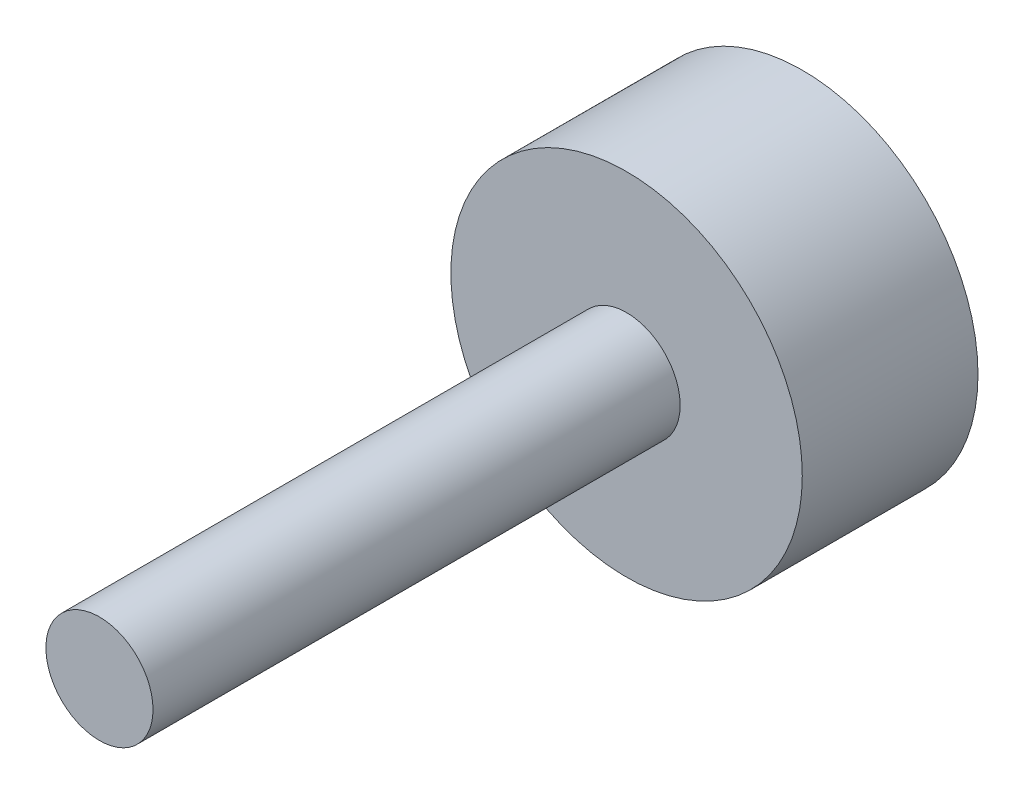
ISO-10303-21;
HEADER;
FILE_DESCRIPTION(('STEP AP214'),'2;1');
FILE_NAME('part.step','',(''),(''),'','','');
FILE_SCHEMA(('AUTOMOTIVE_DESIGN { 1 0 10303 214 1 1 1 1 }'));
ENDSEC;
DATA;
#1=APPLICATION_CONTEXT('core data for automotive mechanical design processes');
#2=APPLICATION_PROTOCOL_DEFINITION('international standard','automotive_design',2000,#1);
#3=PRODUCT_CONTEXT('',#1,'mechanical');
#4=PRODUCT('Part','Part','',(#3));
#5=PRODUCT_RELATED_PRODUCT_CATEGORY('part','',(#4));
#6=PRODUCT_DEFINITION_FORMATION('','',#4);
#7=PRODUCT_DEFINITION_CONTEXT('part definition',#1,'design');
#8=PRODUCT_DEFINITION('design','',#6,#7);
#9=PRODUCT_DEFINITION_SHAPE('','',#8);
#10=(LENGTH_UNIT() NAMED_UNIT(*) SI_UNIT(.MILLI.,.METRE.));
#11=(NAMED_UNIT(*) PLANE_ANGLE_UNIT() SI_UNIT($,.RADIAN.));
#12=(NAMED_UNIT(*) SI_UNIT($,.STERADIAN.) SOLID_ANGLE_UNIT());
#13=UNCERTAINTY_MEASURE_WITH_UNIT(LENGTH_MEASURE(1.E-05),#10,'distance_accuracy_value','');
#14=(GEOMETRIC_REPRESENTATION_CONTEXT(3) GLOBAL_UNCERTAINTY_ASSIGNED_CONTEXT((#13)) GLOBAL_UNIT_ASSIGNED_CONTEXT((#10,
#11,#12)) REPRESENTATION_CONTEXT('',''));
#15=CARTESIAN_POINT('',(0.,0.,0.));
#16=DIRECTION('',(0.,0.,1.));
#17=DIRECTION('',(1.,0.,0.));
#18=AXIS2_PLACEMENT_3D('',#15,#16,#17);
#19=CARTESIAN_POINT('',(0.,0.,5.));
#20=DIRECTION('',(0.,0.,-1.));
#21=DIRECTION('',(-1.,0.,0.));
#22=AXIS2_PLACEMENT_3D('',#19,#20,#21);
#23=CYLINDRICAL_SURFACE('',#22,5.);
#24=CARTESIAN_POINT('',(0.,0.,5.));
#25=DIRECTION('',(0.,0.,1.));
#26=DIRECTION('',(1.,0.,0.));
#27=AXIS2_PLACEMENT_3D('',#24,#25,#26);
#28=CIRCLE('',#27,5.);
#29=CARTESIAN_POINT('',(5.,0.,5.));
#30=VERTEX_POINT('',#29);
#31=EDGE_CURVE('E10',#30,#30,#28,.T.);
#32=ORIENTED_EDGE('',*,*,#31,.F.);
#33=EDGE_LOOP('',(#32));
#34=FACE_BOUND('',#33,.T.);
#35=CARTESIAN_POINT('',(0.,0.,0.));
#36=DIRECTION('',(0.,0.,1.));
#37=DIRECTION('',(1.,0.,0.));
#38=AXIS2_PLACEMENT_3D('',#35,#36,#37);
#39=CIRCLE('',#38,5.);
#40=CARTESIAN_POINT('',(5.,0.,0.));
#41=VERTEX_POINT('',#40);
#42=EDGE_CURVE('E35',#41,#41,#39,.T.);
#43=ORIENTED_EDGE('',*,*,#42,.T.);
#44=EDGE_LOOP('',(#43));
#45=FACE_BOUND('',#44,.T.);
#46=ADVANCED_FACE('F32',(#34,#45),#23,.T.);
#47=CARTESIAN_POINT('',(0.,0.,5.));
#48=DIRECTION('',(0.,0.,1.));
#49=DIRECTION('',(1.,0.,0.));
#50=AXIS2_PLACEMENT_3D('',#47,#48,#49);
#51=PLANE('',#50);
#52=CARTESIAN_POINT('',(0.,0.,5.));
#53=DIRECTION('',(0.,0.,1.));
#54=DIRECTION('',(1.,0.,0.));
#55=AXIS2_PLACEMENT_3D('',#52,#53,#54);
#56=CIRCLE('',#55,1.524);
#57=CARTESIAN_POINT('',(1.524,0.,5.));
#58=VERTEX_POINT('',#57);
#59=EDGE_CURVE('E44',#58,#58,#56,.T.);
#60=ORIENTED_EDGE('',*,*,#59,.F.);
#61=EDGE_LOOP('',(#60));
#62=FACE_BOUND('',#61,.T.);
#63=ORIENTED_EDGE('',*,*,#31,.T.);
#64=EDGE_LOOP('',(#63));
#65=FACE_BOUND('',#64,.T.);
#66=ADVANCED_FACE('F59',(#62,#65),#51,.T.);
#67=CARTESIAN_POINT('',(0.,0.,0.));
#68=DIRECTION('',(0.,0.,1.));
#69=DIRECTION('',(1.,0.,0.));
#70=AXIS2_PLACEMENT_3D('',#67,#68,#69);
#71=PLANE('',#70);
#72=ORIENTED_EDGE('',*,*,#42,.F.);
#73=EDGE_LOOP('',(#72));
#74=FACE_BOUND('',#73,.T.);
#75=ADVANCED_FACE('F55',(#74),#71,.F.);
#76=CARTESIAN_POINT('',(0.,0.,20.));
#77=DIRECTION('',(0.,0.,-1.));
#78=DIRECTION('',(-1.,0.,0.));
#79=AXIS2_PLACEMENT_3D('',#76,#77,#78);
#80=CYLINDRICAL_SURFACE('',#79,1.524);
#81=CARTESIAN_POINT('',(0.,0.,20.));
#82=DIRECTION('',(0.,0.,1.));
#83=DIRECTION('',(1.,0.,0.));
#84=AXIS2_PLACEMENT_3D('',#81,#82,#83);
#85=CIRCLE('',#84,1.524);
#86=CARTESIAN_POINT('',(1.524,0.,20.));
#87=VERTEX_POINT('',#86);
#88=EDGE_CURVE('E42',#87,#87,#85,.T.);
#89=ORIENTED_EDGE('',*,*,#88,.F.);
#90=EDGE_LOOP('',(#89));
#91=FACE_BOUND('',#90,.T.);
#92=ORIENTED_EDGE('',*,*,#59,.T.);
#93=EDGE_LOOP('',(#92));
#94=FACE_BOUND('',#93,.T.);
#95=ADVANCED_FACE('F52',(#91,#94),#80,.T.);
#96=CARTESIAN_POINT('',(0.,0.,20.));
#97=DIRECTION('',(0.,0.,1.));
#98=DIRECTION('',(1.,0.,0.));
#99=AXIS2_PLACEMENT_3D('',#96,#97,#98);
#100=PLANE('',#99);
#101=ORIENTED_EDGE('',*,*,#88,.T.);
#102=EDGE_LOOP('',(#101));
#103=FACE_BOUND('',#102,.T.);
#104=ADVANCED_FACE('F50',(#103),#100,.T.);
#105=CLOSED_SHELL('',(#46,#66,#75,#95,#104));
#106=MANIFOLD_SOLID_BREP('B2',#105);
#107=ADVANCED_BREP_SHAPE_REPRESENTATION('',(#18,#106),#14);
#108=SHAPE_DEFINITION_REPRESENTATION(#9,#107);
ENDSEC;
END-ISO-10303-21;
